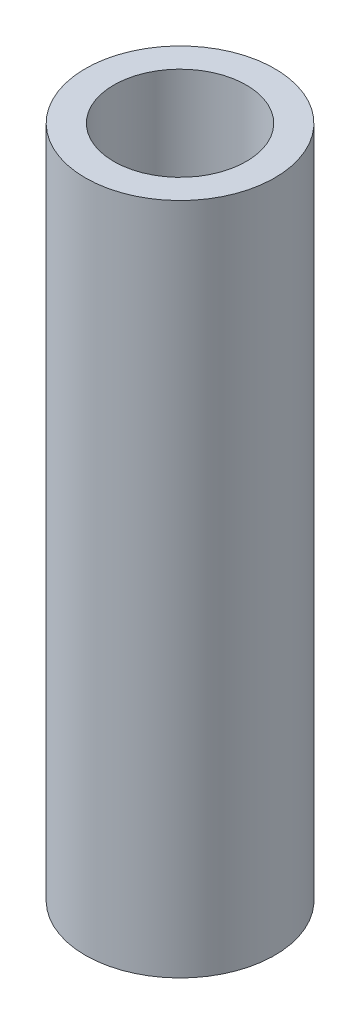
ISO-10303-21;
HEADER;
FILE_DESCRIPTION(('STEP AP214'),'2;1');
FILE_NAME('part.step','',(''),(''),'','','');
FILE_SCHEMA(('AUTOMOTIVE_DESIGN { 1 0 10303 214 1 1 1 1 }'));
ENDSEC;
DATA;
#1=APPLICATION_CONTEXT('core data for automotive mechanical design processes');
#2=APPLICATION_PROTOCOL_DEFINITION('international standard','automotive_design',2000,#1);
#3=PRODUCT_CONTEXT('',#1,'mechanical');
#4=PRODUCT('Part','Part','',(#3));
#5=PRODUCT_RELATED_PRODUCT_CATEGORY('part','',(#4));
#6=PRODUCT_DEFINITION_FORMATION('','',#4);
#7=PRODUCT_DEFINITION_CONTEXT('part definition',#1,'design');
#8=PRODUCT_DEFINITION('design','',#6,#7);
#9=PRODUCT_DEFINITION_SHAPE('','',#8);
#10=(LENGTH_UNIT() NAMED_UNIT(*) SI_UNIT(.MILLI.,.METRE.));
#11=(NAMED_UNIT(*) PLANE_ANGLE_UNIT() SI_UNIT($,.RADIAN.));
#12=(NAMED_UNIT(*) SI_UNIT($,.STERADIAN.) SOLID_ANGLE_UNIT());
#13=UNCERTAINTY_MEASURE_WITH_UNIT(LENGTH_MEASURE(1.E-05),#10,'distance_accuracy_value','');
#14=(GEOMETRIC_REPRESENTATION_CONTEXT(3) GLOBAL_UNCERTAINTY_ASSIGNED_CONTEXT((#13)) GLOBAL_UNIT_ASSIGNED_CONTEXT((#10,
#11,#12)) REPRESENTATION_CONTEXT('',''));
#15=CARTESIAN_POINT('',(0.,0.,0.));
#16=DIRECTION('',(0.,0.,1.));
#17=DIRECTION('',(1.,0.,0.));
#18=AXIS2_PLACEMENT_3D('',#15,#16,#17);
#19=CARTESIAN_POINT('',(0.,-20.32,0.));
#20=DIRECTION('',(0.,1.,0.));
#21=DIRECTION('',(0.,0.,1.));
#22=AXIS2_PLACEMENT_3D('',#19,#20,#21);
#23=CYLINDRICAL_SURFACE('',#22,2.8575);
#24=CARTESIAN_POINT('',(0.,-20.32,0.));
#25=DIRECTION('',(0.,1.,0.));
#26=DIRECTION('',(0.,0.,1.));
#27=AXIS2_PLACEMENT_3D('',#24,#25,#26);
#28=CIRCLE('',#27,2.8575);
#29=CARTESIAN_POINT('',(0.,-20.32,2.8575));
#30=VERTEX_POINT('',#29);
#31=EDGE_CURVE('E10',#30,#30,#28,.T.);
#32=ORIENTED_EDGE('',*,*,#31,.T.);
#33=EDGE_LOOP('',(#32));
#34=FACE_BOUND('',#33,.T.);
#35=CARTESIAN_POINT('',(0.,0.,0.));
#36=DIRECTION('',(0.,1.,0.));
#37=DIRECTION('',(0.,0.,1.));
#38=AXIS2_PLACEMENT_3D('',#35,#36,#37);
#39=CIRCLE('',#38,2.8575);
#40=CARTESIAN_POINT('',(0.,0.,2.8575));
#41=VERTEX_POINT('',#40);
#42=EDGE_CURVE('E40',#41,#41,#39,.T.);
#43=ORIENTED_EDGE('',*,*,#42,.F.);
#44=EDGE_LOOP('',(#43));
#45=FACE_BOUND('',#44,.T.);
#46=ADVANCED_FACE('F37',(#34,#45),#23,.T.);
#47=CARTESIAN_POINT('',(0.,-20.32,0.));
#48=DIRECTION('',(0.,1.,0.));
#49=DIRECTION('',(0.,0.,1.));
#50=AXIS2_PLACEMENT_3D('',#47,#48,#49);
#51=PLANE('',#50);
#52=CARTESIAN_POINT('',(0.,-20.32,0.));
#53=DIRECTION('',(0.,1.,0.));
#54=DIRECTION('',(0.,0.,1.));
#55=AXIS2_PLACEMENT_3D('',#52,#53,#54);
#56=CIRCLE('',#55,2.);
#57=CARTESIAN_POINT('',(0.,-20.32,2.));
#58=VERTEX_POINT('',#57);
#59=EDGE_CURVE('E49',#58,#58,#56,.T.);
#60=ORIENTED_EDGE('',*,*,#59,.T.);
#61=EDGE_LOOP('',(#60));
#62=FACE_BOUND('',#61,.T.);
#63=ORIENTED_EDGE('',*,*,#31,.F.);
#64=EDGE_LOOP('',(#63));
#65=FACE_BOUND('',#64,.T.);
#66=ADVANCED_FACE('F59',(#62,#65),#51,.F.);
#67=CARTESIAN_POINT('',(0.,0.,0.));
#68=DIRECTION('',(0.,1.,0.));
#69=DIRECTION('',(0.,0.,1.));
#70=AXIS2_PLACEMENT_3D('',#67,#68,#69);
#71=PLANE('',#70);
#72=CARTESIAN_POINT('',(0.,0.,0.));
#73=DIRECTION('',(0.,1.,0.));
#74=DIRECTION('',(0.,0.,1.));
#75=AXIS2_PLACEMENT_3D('',#72,#73,#74);
#76=CIRCLE('',#75,2.);
#77=CARTESIAN_POINT('',(0.,0.,2.));
#78=VERTEX_POINT('',#77);
#79=EDGE_CURVE('E51',#78,#78,#76,.T.);
#80=ORIENTED_EDGE('',*,*,#79,.F.);
#81=EDGE_LOOP('',(#80));
#82=FACE_BOUND('',#81,.T.);
#83=ORIENTED_EDGE('',*,*,#42,.T.);
#84=EDGE_LOOP('',(#83));
#85=FACE_BOUND('',#84,.T.);
#86=ADVANCED_FACE('F65',(#82,#85),#71,.T.);
#87=CARTESIAN_POINT('',(0.,-20.32,0.));
#88=DIRECTION('',(0.,1.,0.));
#89=DIRECTION('',(0.,0.,1.));
#90=AXIS2_PLACEMENT_3D('',#87,#88,#89);
#91=CYLINDRICAL_SURFACE('',#90,2.);
#92=ORIENTED_EDGE('',*,*,#59,.F.);
#93=EDGE_LOOP('',(#92));
#94=FACE_BOUND('',#93,.T.);
#95=ORIENTED_EDGE('',*,*,#79,.T.);
#96=EDGE_LOOP('',(#95));
#97=FACE_BOUND('',#96,.T.);
#98=ADVANCED_FACE('F62',(#94,#97),#91,.F.);
#99=CLOSED_SHELL('',(#46,#66,#86,#98));
#100=MANIFOLD_SOLID_BREP('B2',#99);
#101=ADVANCED_BREP_SHAPE_REPRESENTATION('',(#18,#100),#14);
#102=SHAPE_DEFINITION_REPRESENTATION(#9,#101);
ENDSEC;
END-ISO-10303-21;
